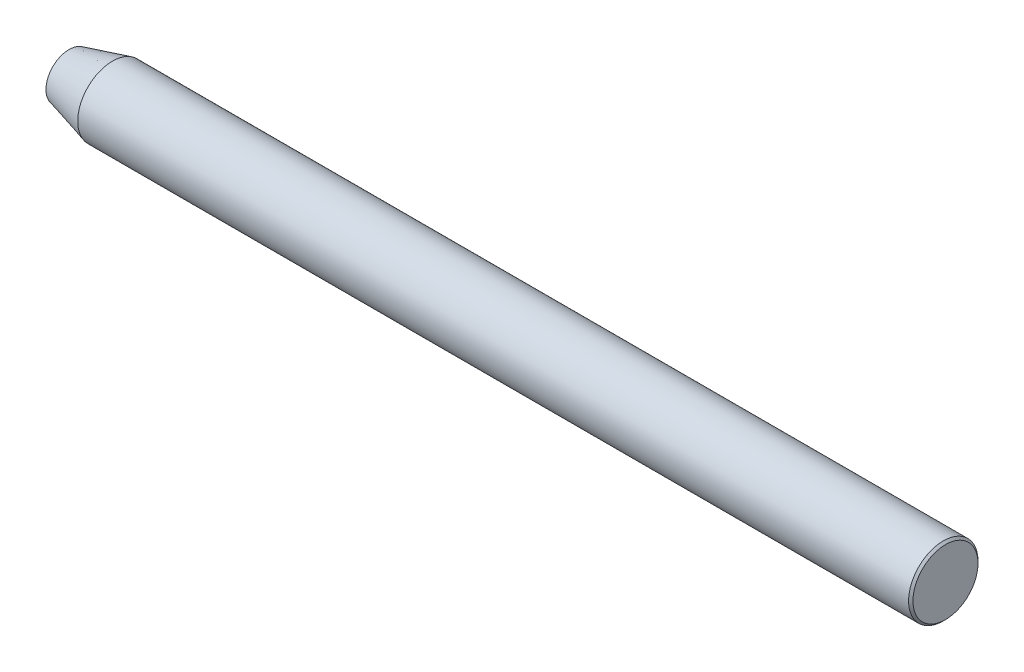
ISO-10303-21;
HEADER;
FILE_DESCRIPTION(('STEP AP214'),'2;1');
FILE_NAME('part.step','',(''),(''),'','','');
FILE_SCHEMA(('AUTOMOTIVE_DESIGN { 1 0 10303 214 1 1 1 1 }'));
ENDSEC;
DATA;
#1=APPLICATION_CONTEXT('core data for automotive mechanical design processes');
#2=APPLICATION_PROTOCOL_DEFINITION('international standard','automotive_design',2000,#1);
#3=PRODUCT_CONTEXT('',#1,'mechanical');
#4=PRODUCT('Part','Part','',(#3));
#5=PRODUCT_RELATED_PRODUCT_CATEGORY('part','',(#4));
#6=PRODUCT_DEFINITION_FORMATION('','',#4);
#7=PRODUCT_DEFINITION_CONTEXT('part definition',#1,'design');
#8=PRODUCT_DEFINITION('design','',#6,#7);
#9=PRODUCT_DEFINITION_SHAPE('','',#8);
#10=(LENGTH_UNIT() NAMED_UNIT(*) SI_UNIT(.MILLI.,.METRE.));
#11=(NAMED_UNIT(*) PLANE_ANGLE_UNIT() SI_UNIT($,.RADIAN.));
#12=(NAMED_UNIT(*) SI_UNIT($,.STERADIAN.) SOLID_ANGLE_UNIT());
#13=UNCERTAINTY_MEASURE_WITH_UNIT(LENGTH_MEASURE(1.E-05),#10,'distance_accuracy_value','');
#14=(GEOMETRIC_REPRESENTATION_CONTEXT(3) GLOBAL_UNCERTAINTY_ASSIGNED_CONTEXT((#13)) GLOBAL_UNIT_ASSIGNED_CONTEXT((#10,
#11,#12)) REPRESENTATION_CONTEXT('',''));
#15=CARTESIAN_POINT('',(0.,0.,0.));
#16=DIRECTION('',(0.,0.,1.));
#17=DIRECTION('',(1.,0.,0.));
#18=AXIS2_PLACEMENT_3D('',#15,#16,#17);
#19=CARTESIAN_POINT('',(9.99999999999982,0.,0.));
#20=DIRECTION('',(1.,0.,0.));
#21=DIRECTION('',(0.,0.,-1.));
#22=AXIS2_PLACEMENT_3D('',#19,#20,#21);
#23=CONICAL_SURFACE('',#22,8.,0.261799387799152);
#24=CARTESIAN_POINT('',(0.,0.,0.));
#25=DIRECTION('',(1.,0.,0.));
#26=DIRECTION('',(0.,0.,-1.));
#27=AXIS2_PLACEMENT_3D('',#24,#25,#26);
#28=CIRCLE('',#27,5.3205080756888);
#29=CARTESIAN_POINT('',(0.,0.,-5.3205080756888));
#30=VERTEX_POINT('',#29);
#31=EDGE_CURVE('E10',#30,#30,#28,.T.);
#32=ORIENTED_EDGE('',*,*,#31,.T.);
#33=EDGE_LOOP('',(#32));
#34=FACE_BOUND('',#33,.T.);
#35=CARTESIAN_POINT('',(9.99999999999982,0.,0.));
#36=DIRECTION('',(1.,0.,0.));
#37=DIRECTION('',(0.,0.,-1.));
#38=AXIS2_PLACEMENT_3D('',#35,#36,#37);
#39=CIRCLE('',#38,8.);
#40=CARTESIAN_POINT('',(9.99999999999982,0.,-8.));
#41=VERTEX_POINT('',#40);
#42=EDGE_CURVE('E51',#41,#41,#39,.T.);
#43=ORIENTED_EDGE('',*,*,#42,.F.);
#44=EDGE_LOOP('',(#43));
#45=FACE_BOUND('',#44,.T.);
#46=ADVANCED_FACE('F37',(#34,#45),#23,.T.);
#47=CARTESIAN_POINT('',(0.,5.3205080756888,0.));
#48=DIRECTION('',(-1.,0.,0.));
#49=DIRECTION('',(0.,0.,1.));
#50=AXIS2_PLACEMENT_3D('',#47,#48,#49);
#51=PLANE('',#50);
#52=ORIENTED_EDGE('',*,*,#31,.F.);
#53=EDGE_LOOP('',(#52));
#54=FACE_BOUND('',#53,.T.);
#55=ADVANCED_FACE('F61',(#54),#51,.T.);
#56=CARTESIAN_POINT('',(202.,0.,0.));
#57=DIRECTION('',(1.,0.,0.));
#58=DIRECTION('',(0.,0.,-1.));
#59=AXIS2_PLACEMENT_3D('',#56,#57,#58);
#60=PLANE('',#59);
#61=CARTESIAN_POINT('',(202.,0.,0.));
#62=DIRECTION('',(1.,0.,0.));
#63=DIRECTION('',(0.,0.,-1.));
#64=AXIS2_PLACEMENT_3D('',#61,#62,#63);
#65=CIRCLE('',#64,7.5);
#66=CARTESIAN_POINT('',(202.,0.,-7.5));
#67=VERTEX_POINT('',#66);
#68=EDGE_CURVE('E43',#67,#67,#65,.T.);
#69=ORIENTED_EDGE('',*,*,#68,.T.);
#70=EDGE_LOOP('',(#69));
#71=FACE_BOUND('',#70,.T.);
#72=ADVANCED_FACE('F65',(#71),#60,.T.);
#73=CARTESIAN_POINT('',(202.,0.,0.));
#74=DIRECTION('',(-1.,0.,0.));
#75=DIRECTION('',(0.,0.,1.));
#76=AXIS2_PLACEMENT_3D('',#73,#74,#75);
#77=CONICAL_SURFACE('',#76,7.5,0.785398163397445);
#78=CARTESIAN_POINT('',(201.5,0.,0.));
#79=DIRECTION('',(1.,0.,0.));
#80=DIRECTION('',(0.,0.,-1.));
#81=AXIS2_PLACEMENT_3D('',#78,#79,#80);
#82=CIRCLE('',#81,8.);
#83=CARTESIAN_POINT('',(201.5,0.,-8.));
#84=VERTEX_POINT('',#83);
#85=EDGE_CURVE('E47',#84,#84,#82,.T.);
#86=ORIENTED_EDGE('',*,*,#85,.T.);
#87=EDGE_LOOP('',(#86));
#88=FACE_BOUND('',#87,.T.);
#89=ORIENTED_EDGE('',*,*,#68,.F.);
#90=EDGE_LOOP('',(#89));
#91=FACE_BOUND('',#90,.T.);
#92=ADVANCED_FACE('F70',(#88,#91),#77,.T.);
#93=CARTESIAN_POINT('',(-0.0049999999999998,0.,0.));
#94=DIRECTION('',(1.,0.,0.));
#95=DIRECTION('',(0.,0.,-1.));
#96=AXIS2_PLACEMENT_3D('',#93,#94,#95);
#97=CYLINDRICAL_SURFACE('',#96,8.);
#98=ORIENTED_EDGE('',*,*,#42,.T.);
#99=EDGE_LOOP('',(#98));
#100=FACE_BOUND('',#99,.T.);
#101=ORIENTED_EDGE('',*,*,#85,.F.);
#102=EDGE_LOOP('',(#101));
#103=FACE_BOUND('',#102,.T.);
#104=ADVANCED_FACE('F57',(#100,#103),#97,.T.);
#105=CLOSED_SHELL('',(#46,#55,#72,#92,#104));
#106=MANIFOLD_SOLID_BREP('B2',#105);
#107=ADVANCED_BREP_SHAPE_REPRESENTATION('',(#18,#106),#14);
#108=SHAPE_DEFINITION_REPRESENTATION(#9,#107);
ENDSEC;
END-ISO-10303-21;
